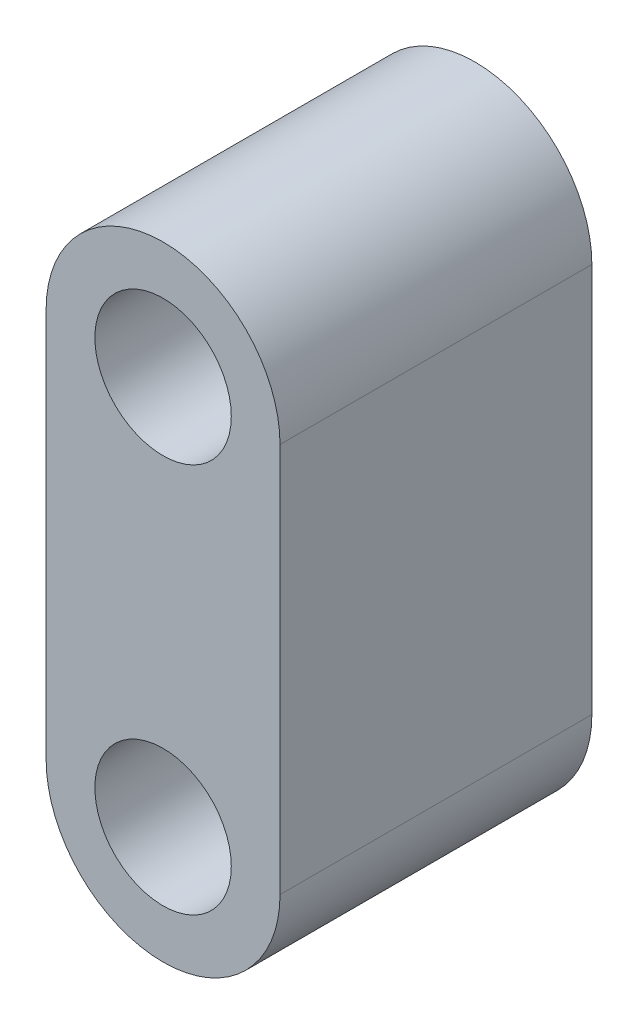
ISO-10303-21;
HEADER;
FILE_DESCRIPTION(('STEP AP214'),'2;1');
FILE_NAME('part.step','',(''),(''),'','','');
FILE_SCHEMA(('AUTOMOTIVE_DESIGN { 1 0 10303 214 1 1 1 1 }'));
ENDSEC;
DATA;
#1=APPLICATION_CONTEXT('core data for automotive mechanical design processes');
#2=APPLICATION_PROTOCOL_DEFINITION('international standard','automotive_design',2000,#1);
#3=PRODUCT_CONTEXT('',#1,'mechanical');
#4=PRODUCT('Part','Part','',(#3));
#5=PRODUCT_RELATED_PRODUCT_CATEGORY('part','',(#4));
#6=PRODUCT_DEFINITION_FORMATION('','',#4);
#7=PRODUCT_DEFINITION_CONTEXT('part definition',#1,'design');
#8=PRODUCT_DEFINITION('design','',#6,#7);
#9=PRODUCT_DEFINITION_SHAPE('','',#8);
#10=(LENGTH_UNIT() NAMED_UNIT(*) SI_UNIT(.MILLI.,.METRE.));
#11=(NAMED_UNIT(*) PLANE_ANGLE_UNIT() SI_UNIT($,.RADIAN.));
#12=(NAMED_UNIT(*) SI_UNIT($,.STERADIAN.) SOLID_ANGLE_UNIT());
#13=UNCERTAINTY_MEASURE_WITH_UNIT(LENGTH_MEASURE(1.E-05),#10,'distance_accuracy_value','');
#14=(GEOMETRIC_REPRESENTATION_CONTEXT(3) GLOBAL_UNCERTAINTY_ASSIGNED_CONTEXT((#13)) GLOBAL_UNIT_ASSIGNED_CONTEXT((#10,
#11,#12)) REPRESENTATION_CONTEXT('',''));
#15=CARTESIAN_POINT('',(0.,0.,0.));
#16=DIRECTION('',(0.,0.,1.));
#17=DIRECTION('',(1.,0.,0.));
#18=AXIS2_PLACEMENT_3D('',#15,#16,#17);
#19=CARTESIAN_POINT('',(3.,5.,8.));
#20=DIRECTION('',(1.,0.,0.));
#21=DIRECTION('',(0.,0.,-1.));
#22=AXIS2_PLACEMENT_3D('',#19,#20,#21);
#23=PLANE('',#22);
#24=DIRECTION('',(0.,-1.,0.));
#25=VECTOR('',#24,1.);
#26=CARTESIAN_POINT('',(3.,5.,0.));
#27=LINE('',#26,#25);
#28=CARTESIAN_POINT('',(3.,5.,0.));
#29=VERTEX_POINT('',#28);
#30=CARTESIAN_POINT('',(3.,-5.,0.));
#31=VERTEX_POINT('',#30);
#32=EDGE_CURVE('E117',#29,#31,#27,.T.);
#33=ORIENTED_EDGE('',*,*,#32,.F.);
#34=DIRECTION('',(0.,0.,-1.));
#35=VECTOR('',#34,1.);
#36=CARTESIAN_POINT('',(3.,5.,8.));
#37=LINE('',#36,#35);
#38=CARTESIAN_POINT('',(3.,5.,8.));
#39=VERTEX_POINT('',#38);
#40=EDGE_CURVE('E11',#39,#29,#37,.T.);
#41=ORIENTED_EDGE('',*,*,#40,.F.);
#42=DIRECTION('',(0.,-1.,0.));
#43=VECTOR('',#42,1.);
#44=CARTESIAN_POINT('',(3.,5.,8.));
#45=LINE('',#44,#43);
#46=CARTESIAN_POINT('',(3.,-5.,8.));
#47=VERTEX_POINT('',#46);
#48=EDGE_CURVE('E109',#39,#47,#45,.T.);
#49=ORIENTED_EDGE('',*,*,#48,.T.);
#50=DIRECTION('',(0.,0.,-1.));
#51=VECTOR('',#50,1.);
#52=CARTESIAN_POINT('',(3.,-5.,8.));
#53=LINE('',#52,#51);
#54=EDGE_CURVE('E48',#47,#31,#53,.T.);
#55=ORIENTED_EDGE('',*,*,#54,.T.);
#56=EDGE_LOOP('',(#33,#41,#49,#55));
#57=FACE_BOUND('',#56,.T.);
#58=ADVANCED_FACE('F45',(#57),#23,.T.);
#59=CARTESIAN_POINT('',(0.,5.,8.));
#60=DIRECTION('',(0.,0.,-1.));
#61=DIRECTION('',(-1.,0.,0.));
#62=AXIS2_PLACEMENT_3D('',#59,#60,#61);
#63=CYLINDRICAL_SURFACE('',#62,3.);
#64=CARTESIAN_POINT('',(0.,5.,0.));
#65=DIRECTION('',(0.,0.,1.));
#66=DIRECTION('',(1.,0.,0.));
#67=AXIS2_PLACEMENT_3D('',#64,#65,#66);
#68=CIRCLE('',#67,3.);
#69=CARTESIAN_POINT('',(-3.,5.,0.));
#70=VERTEX_POINT('',#69);
#71=EDGE_CURVE('E79',#29,#70,#68,.T.);
#72=ORIENTED_EDGE('',*,*,#71,.T.);
#73=DIRECTION('',(0.,0.,-1.));
#74=VECTOR('',#73,1.);
#75=CARTESIAN_POINT('',(-3.,5.,8.));
#76=LINE('',#75,#74);
#77=CARTESIAN_POINT('',(-3.,5.,8.));
#78=VERTEX_POINT('',#77);
#79=EDGE_CURVE('E55',#78,#70,#76,.T.);
#80=ORIENTED_EDGE('',*,*,#79,.F.);
#81=CARTESIAN_POINT('',(0.,5.,8.));
#82=DIRECTION('',(0.,0.,1.));
#83=DIRECTION('',(1.,0.,0.));
#84=AXIS2_PLACEMENT_3D('',#81,#82,#83);
#85=CIRCLE('',#84,3.);
#86=EDGE_CURVE('E94',#39,#78,#85,.T.);
#87=ORIENTED_EDGE('',*,*,#86,.F.);
#88=ORIENTED_EDGE('',*,*,#40,.T.);
#89=EDGE_LOOP('',(#72,#80,#87,#88));
#90=FACE_BOUND('',#89,.T.);
#91=ADVANCED_FACE('F134',(#90),#63,.T.);
#92=CARTESIAN_POINT('',(-3.,5.,8.));
#93=DIRECTION('',(1.,0.,0.));
#94=DIRECTION('',(0.,0.,-1.));
#95=AXIS2_PLACEMENT_3D('',#92,#93,#94);
#96=PLANE('',#95);
#97=DIRECTION('',(0.,-1.,0.));
#98=VECTOR('',#97,1.);
#99=CARTESIAN_POINT('',(-3.,5.,0.));
#100=LINE('',#99,#98);
#101=CARTESIAN_POINT('',(-3.,-5.,0.));
#102=VERTEX_POINT('',#101);
#103=EDGE_CURVE('E102',#70,#102,#100,.T.);
#104=ORIENTED_EDGE('',*,*,#103,.T.);
#105=DIRECTION('',(0.,0.,-1.));
#106=VECTOR('',#105,1.);
#107=CARTESIAN_POINT('',(-3.,-5.,8.));
#108=LINE('',#107,#106);
#109=CARTESIAN_POINT('',(-3.,-5.,8.));
#110=VERTEX_POINT('',#109);
#111=EDGE_CURVE('E99',#110,#102,#108,.T.);
#112=ORIENTED_EDGE('',*,*,#111,.F.);
#113=DIRECTION('',(0.,-1.,0.));
#114=VECTOR('',#113,1.);
#115=CARTESIAN_POINT('',(-3.,5.,8.));
#116=LINE('',#115,#114);
#117=EDGE_CURVE('E91',#78,#110,#116,.T.);
#118=ORIENTED_EDGE('',*,*,#117,.F.);
#119=ORIENTED_EDGE('',*,*,#79,.T.);
#120=EDGE_LOOP('',(#104,#112,#118,#119));
#121=FACE_BOUND('',#120,.T.);
#122=ADVANCED_FACE('F100',(#121),#96,.F.);
#123=CARTESIAN_POINT('',(0.,-5.,8.));
#124=DIRECTION('',(0.,0.,-1.));
#125=DIRECTION('',(-1.,0.,0.));
#126=AXIS2_PLACEMENT_3D('',#123,#124,#125);
#127=CYLINDRICAL_SURFACE('',#126,3.);
#128=CARTESIAN_POINT('',(0.,-5.,0.));
#129=DIRECTION('',(0.,0.,1.));
#130=DIRECTION('',(1.,0.,0.));
#131=AXIS2_PLACEMENT_3D('',#128,#129,#130);
#132=CIRCLE('',#131,3.);
#133=EDGE_CURVE('E121',#102,#31,#132,.T.);
#134=ORIENTED_EDGE('',*,*,#133,.T.);
#135=ORIENTED_EDGE('',*,*,#54,.F.);
#136=CARTESIAN_POINT('',(0.,-5.,8.));
#137=DIRECTION('',(0.,0.,1.));
#138=DIRECTION('',(1.,0.,0.));
#139=AXIS2_PLACEMENT_3D('',#136,#137,#138);
#140=CIRCLE('',#139,3.);
#141=EDGE_CURVE('E88',#110,#47,#140,.T.);
#142=ORIENTED_EDGE('',*,*,#141,.F.);
#143=ORIENTED_EDGE('',*,*,#111,.T.);
#144=EDGE_LOOP('',(#134,#135,#142,#143));
#145=FACE_BOUND('',#144,.T.);
#146=ADVANCED_FACE('F107',(#145),#127,.T.);
#147=CARTESIAN_POINT('',(0.,-5.,8.));
#148=DIRECTION('',(0.,0.,1.));
#149=DIRECTION('',(1.,0.,0.));
#150=AXIS2_PLACEMENT_3D('',#147,#148,#149);
#151=PLANE('',#150);
#152=CARTESIAN_POINT('',(0.,-5.,8.));
#153=DIRECTION('',(0.,0.,-1.));
#154=DIRECTION('',(1.,0.,0.));
#155=AXIS2_PLACEMENT_3D('',#152,#153,#154);
#156=CIRCLE('',#155,1.75);
#157=CARTESIAN_POINT('',(1.75,-5.,8.));
#158=VERTEX_POINT('',#157);
#159=EDGE_CURVE('E171',#158,#158,#156,.T.);
#160=ORIENTED_EDGE('',*,*,#159,.T.);
#161=EDGE_LOOP('',(#160));
#162=FACE_BOUND('',#161,.T.);
#163=CARTESIAN_POINT('',(0.,5.,8.));
#164=DIRECTION('',(0.,0.,1.));
#165=DIRECTION('',(1.,0.,0.));
#166=AXIS2_PLACEMENT_3D('',#163,#164,#165);
#167=CIRCLE('',#166,1.75);
#168=CARTESIAN_POINT('',(1.75,5.,8.));
#169=VERTEX_POINT('',#168);
#170=EDGE_CURVE('E175',#169,#169,#167,.T.);
#171=ORIENTED_EDGE('',*,*,#170,.F.);
#172=EDGE_LOOP('',(#171));
#173=FACE_BOUND('',#172,.T.);
#174=ORIENTED_EDGE('',*,*,#48,.F.);
#175=ORIENTED_EDGE('',*,*,#86,.T.);
#176=ORIENTED_EDGE('',*,*,#117,.T.);
#177=ORIENTED_EDGE('',*,*,#141,.T.);
#178=EDGE_LOOP('',(#174,#175,#176,#177));
#179=FACE_BOUND('',#178,.T.);
#180=ADVANCED_FACE('F93',(#162,#173,#179),#151,.T.);
#181=CARTESIAN_POINT('',(0.,-5.,0.));
#182=DIRECTION('',(0.,0.,1.));
#183=DIRECTION('',(1.,0.,0.));
#184=AXIS2_PLACEMENT_3D('',#181,#182,#183);
#185=PLANE('',#184);
#186=CARTESIAN_POINT('',(0.,-5.,0.));
#187=DIRECTION('',(0.,0.,1.));
#188=DIRECTION('',(1.,0.,0.));
#189=AXIS2_PLACEMENT_3D('',#186,#187,#188);
#190=CIRCLE('',#189,1.75);
#191=CARTESIAN_POINT('',(1.75,-5.,0.));
#192=VERTEX_POINT('',#191);
#193=EDGE_CURVE('E169',#192,#192,#190,.T.);
#194=ORIENTED_EDGE('',*,*,#193,.T.);
#195=EDGE_LOOP('',(#194));
#196=FACE_BOUND('',#195,.T.);
#197=CARTESIAN_POINT('',(0.,5.,0.));
#198=DIRECTION('',(0.,0.,1.));
#199=DIRECTION('',(1.,0.,0.));
#200=AXIS2_PLACEMENT_3D('',#197,#198,#199);
#201=CIRCLE('',#200,1.75);
#202=CARTESIAN_POINT('',(1.75,5.,0.));
#203=VERTEX_POINT('',#202);
#204=EDGE_CURVE('E122',#203,#203,#201,.F.);
#205=ORIENTED_EDGE('',*,*,#204,.F.);
#206=EDGE_LOOP('',(#205));
#207=FACE_BOUND('',#206,.T.);
#208=ORIENTED_EDGE('',*,*,#32,.T.);
#209=ORIENTED_EDGE('',*,*,#133,.F.);
#210=ORIENTED_EDGE('',*,*,#103,.F.);
#211=ORIENTED_EDGE('',*,*,#71,.F.);
#212=EDGE_LOOP('',(#208,#209,#210,#211));
#213=FACE_BOUND('',#212,.T.);
#214=ADVANCED_FACE('F131',(#196,#207,#213),#185,.F.);
#215=CARTESIAN_POINT('',(0.,5.,-4.94974746830583));
#216=DIRECTION('',(0.,0.,1.));
#217=DIRECTION('',(1.,0.,0.));
#218=AXIS2_PLACEMENT_3D('',#215,#216,#217);
#219=CYLINDRICAL_SURFACE('',#218,1.75);
#220=ORIENTED_EDGE('',*,*,#204,.T.);
#221=EDGE_LOOP('',(#220));
#222=FACE_BOUND('',#221,.T.);
#223=ORIENTED_EDGE('',*,*,#170,.T.);
#224=EDGE_LOOP('',(#223));
#225=FACE_BOUND('',#224,.T.);
#226=ADVANCED_FACE('F154',(#222,#225),#219,.F.);
#227=CARTESIAN_POINT('',(0.,-5.,-4.94974746830583));
#228=DIRECTION('',(0.,0.,1.));
#229=DIRECTION('',(1.,0.,0.));
#230=AXIS2_PLACEMENT_3D('',#227,#228,#229);
#231=CYLINDRICAL_SURFACE('',#230,1.75);
#232=ORIENTED_EDGE('',*,*,#193,.F.);
#233=EDGE_LOOP('',(#232));
#234=FACE_BOUND('',#233,.T.);
#235=ORIENTED_EDGE('',*,*,#159,.F.);
#236=EDGE_LOOP('',(#235));
#237=FACE_BOUND('',#236,.T.);
#238=ADVANCED_FACE('F160',(#234,#237),#231,.F.);
#239=CLOSED_SHELL('',(#58,#91,#122,#146,#180,#214,#226,#238));
#240=MANIFOLD_SOLID_BREP('B2',#239);
#241=ADVANCED_BREP_SHAPE_REPRESENTATION('',(#18,#240),#14);
#242=SHAPE_DEFINITION_REPRESENTATION(#9,#241);
ENDSEC;
END-ISO-10303-21;
